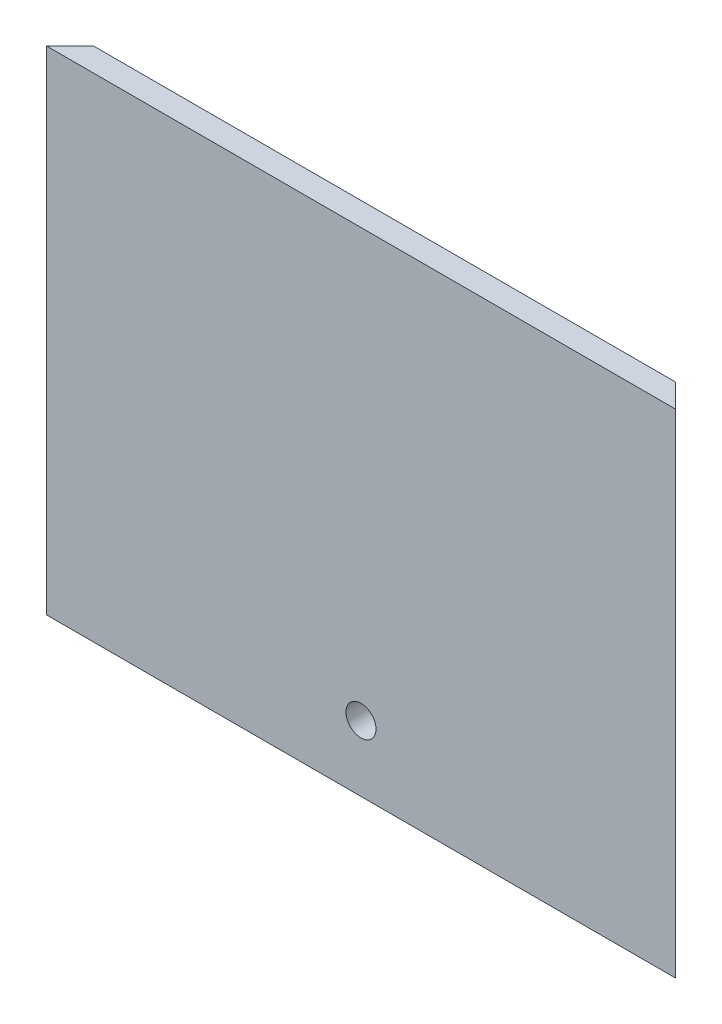
ISO-10303-21;
HEADER;
FILE_DESCRIPTION(('STEP AP214'),'2;1');
FILE_NAME('part.step','',(''),(''),'','','');
FILE_SCHEMA(('AUTOMOTIVE_DESIGN { 1 0 10303 214 1 1 1 1 }'));
ENDSEC;
DATA;
#1=APPLICATION_CONTEXT('core data for automotive mechanical design processes');
#2=APPLICATION_PROTOCOL_DEFINITION('international standard','automotive_design',2000,#1);
#3=PRODUCT_CONTEXT('',#1,'mechanical');
#4=PRODUCT('Part','Part','',(#3));
#5=PRODUCT_RELATED_PRODUCT_CATEGORY('part','',(#4));
#6=PRODUCT_DEFINITION_FORMATION('','',#4);
#7=PRODUCT_DEFINITION_CONTEXT('part definition',#1,'design');
#8=PRODUCT_DEFINITION('design','',#6,#7);
#9=PRODUCT_DEFINITION_SHAPE('','',#8);
#10=(LENGTH_UNIT() NAMED_UNIT(*) SI_UNIT(.MILLI.,.METRE.));
#11=(NAMED_UNIT(*) PLANE_ANGLE_UNIT() SI_UNIT($,.RADIAN.));
#12=(NAMED_UNIT(*) SI_UNIT($,.STERADIAN.) SOLID_ANGLE_UNIT());
#13=UNCERTAINTY_MEASURE_WITH_UNIT(LENGTH_MEASURE(1.E-05),#10,'distance_accuracy_value','');
#14=(GEOMETRIC_REPRESENTATION_CONTEXT(3) GLOBAL_UNCERTAINTY_ASSIGNED_CONTEXT((#13)) GLOBAL_UNIT_ASSIGNED_CONTEXT((#10,
#11,#12)) REPRESENTATION_CONTEXT('',''));
#15=CARTESIAN_POINT('',(0.,0.,0.));
#16=DIRECTION('',(0.,0.,1.));
#17=DIRECTION('',(1.,0.,0.));
#18=AXIS2_PLACEMENT_3D('',#15,#16,#17);
#19=CARTESIAN_POINT('',(0.,52.5,1.25));
#20=DIRECTION('',(0.,0.,1.));
#21=DIRECTION('',(1.,0.,0.));
#22=AXIS2_PLACEMENT_3D('',#19,#20,#21);
#23=PLANE('',#22);
#24=CARTESIAN_POINT('',(0.,7.,1.25));
#25=DIRECTION('',(0.,0.,1.));
#26=DIRECTION('',(1.,0.,0.));
#27=AXIS2_PLACEMENT_3D('',#24,#25,#26);
#28=CIRCLE('',#27,1.6);
#29=CARTESIAN_POINT('',(1.6,7.,1.25));
#30=VERTEX_POINT('',#29);
#31=EDGE_CURVE('E126',#30,#30,#28,.T.);
#32=ORIENTED_EDGE('',*,*,#31,.F.);
#33=EDGE_LOOP('',(#32));
#34=FACE_BOUND('',#33,.T.);
#35=DIRECTION('',(-1.,0.,0.));
#36=VECTOR('',#35,1.);
#37=CARTESIAN_POINT('',(0.,0.,1.25));
#38=LINE('',#37,#36);
#39=CARTESIAN_POINT('',(33.5,0.,1.25));
#40=VERTEX_POINT('',#39);
#41=CARTESIAN_POINT('',(-33.5,0.,1.25));
#42=VERTEX_POINT('',#41);
#43=EDGE_CURVE('E107',#40,#42,#38,.T.);
#44=ORIENTED_EDGE('',*,*,#43,.F.);
#45=DIRECTION('',(0.,-1.,0.));
#46=VECTOR('',#45,1.);
#47=CARTESIAN_POINT('',(33.5,52.5,1.25));
#48=LINE('',#47,#46);
#49=CARTESIAN_POINT('',(33.5,52.5,1.25));
#50=VERTEX_POINT('',#49);
#51=EDGE_CURVE('E11',#50,#40,#48,.T.);
#52=ORIENTED_EDGE('',*,*,#51,.F.);
#53=DIRECTION('',(-1.,0.,0.));
#54=VECTOR('',#53,1.);
#55=CARTESIAN_POINT('',(0.,52.5,1.25));
#56=LINE('',#55,#54);
#57=CARTESIAN_POINT('',(-33.5,52.5,1.25));
#58=VERTEX_POINT('',#57);
#59=EDGE_CURVE('E88',#50,#58,#56,.T.);
#60=ORIENTED_EDGE('',*,*,#59,.T.);
#61=DIRECTION('',(0.,-1.,0.));
#62=VECTOR('',#61,1.);
#63=CARTESIAN_POINT('',(-33.5,52.5,1.25));
#64=LINE('',#63,#62);
#65=EDGE_CURVE('E56',#58,#42,#64,.T.);
#66=ORIENTED_EDGE('',*,*,#65,.T.);
#67=EDGE_LOOP('',(#44,#52,#60,#66));
#68=FACE_BOUND('',#67,.T.);
#69=ADVANCED_FACE('F39',(#34,#68),#23,.T.);
#70=CARTESIAN_POINT('',(16.1249999999999,52.5,-16.125));
#71=DIRECTION('',(-0.707106781186546,0.,0.707106781186549));
#72=DIRECTION('',(0.707106781186549,0.,0.707106781186546));
#73=AXIS2_PLACEMENT_3D('',#70,#71,#72);
#74=PLANE('',#73);
#75=DIRECTION('',(-0.707106781186549,0.,-0.707106781186546));
#76=VECTOR('',#75,1.);
#77=CARTESIAN_POINT('',(16.1249999999999,0.,-16.125));
#78=LINE('',#77,#76);
#79=CARTESIAN_POINT('',(31.,0.,-1.25));
#80=VERTEX_POINT('',#79);
#81=EDGE_CURVE('E95',#40,#80,#78,.T.);
#82=ORIENTED_EDGE('',*,*,#81,.T.);
#83=DIRECTION('',(0.,-1.,0.));
#84=VECTOR('',#83,1.);
#85=CARTESIAN_POINT('',(31.,52.5,-1.25));
#86=LINE('',#85,#84);
#87=CARTESIAN_POINT('',(31.,52.5,-1.25));
#88=VERTEX_POINT('',#87);
#89=EDGE_CURVE('E48',#88,#80,#86,.T.);
#90=ORIENTED_EDGE('',*,*,#89,.F.);
#91=DIRECTION('',(-0.707106781186549,0.,-0.707106781186546));
#92=VECTOR('',#91,1.);
#93=CARTESIAN_POINT('',(16.1249999999999,52.5,-16.125));
#94=LINE('',#93,#92);
#95=EDGE_CURVE('E82',#50,#88,#94,.T.);
#96=ORIENTED_EDGE('',*,*,#95,.F.);
#97=ORIENTED_EDGE('',*,*,#51,.T.);
#98=EDGE_LOOP('',(#82,#90,#96,#97));
#99=FACE_BOUND('',#98,.T.);
#100=ADVANCED_FACE('F93',(#99),#74,.F.);
#101=CARTESIAN_POINT('',(0.,52.5,-1.25));
#102=DIRECTION('',(0.,0.,1.));
#103=DIRECTION('',(1.,0.,0.));
#104=AXIS2_PLACEMENT_3D('',#101,#102,#103);
#105=PLANE('',#104);
#106=CARTESIAN_POINT('',(0.,7.,-1.25));
#107=DIRECTION('',(0.,0.,1.));
#108=DIRECTION('',(1.,0.,0.));
#109=AXIS2_PLACEMENT_3D('',#106,#107,#108);
#110=CIRCLE('',#109,1.6);
#111=CARTESIAN_POINT('',(1.6,7.,-1.25));
#112=VERTEX_POINT('',#111);
#113=EDGE_CURVE('E110',#112,#112,#110,.T.);
#114=ORIENTED_EDGE('',*,*,#113,.T.);
#115=EDGE_LOOP('',(#114));
#116=FACE_BOUND('',#115,.T.);
#117=DIRECTION('',(-1.,0.,0.));
#118=VECTOR('',#117,1.);
#119=CARTESIAN_POINT('',(0.,0.,-1.25));
#120=LINE('',#119,#118);
#121=CARTESIAN_POINT('',(-31.,0.,-1.25));
#122=VERTEX_POINT('',#121);
#123=EDGE_CURVE('E113',#80,#122,#120,.T.);
#124=ORIENTED_EDGE('',*,*,#123,.T.);
#125=DIRECTION('',(0.,-1.,0.));
#126=VECTOR('',#125,1.);
#127=CARTESIAN_POINT('',(-31.,52.5,-1.25));
#128=LINE('',#127,#126);
#129=CARTESIAN_POINT('',(-31.,52.5,-1.25));
#130=VERTEX_POINT('',#129);
#131=EDGE_CURVE('E70',#130,#122,#128,.T.);
#132=ORIENTED_EDGE('',*,*,#131,.F.);
#133=DIRECTION('',(-1.,0.,0.));
#134=VECTOR('',#133,1.);
#135=CARTESIAN_POINT('',(0.,52.5,-1.25));
#136=LINE('',#135,#134);
#137=EDGE_CURVE('E87',#88,#130,#136,.T.);
#138=ORIENTED_EDGE('',*,*,#137,.F.);
#139=ORIENTED_EDGE('',*,*,#89,.T.);
#140=EDGE_LOOP('',(#124,#132,#138,#139));
#141=FACE_BOUND('',#140,.T.);
#142=ADVANCED_FACE('F99',(#116,#141),#105,.F.);
#143=CARTESIAN_POINT('',(-16.1250000000001,52.5,-16.125));
#144=DIRECTION('',(-0.707106781186549,0.,-0.707106781186546));
#145=DIRECTION('',(-0.707106781186546,0.,0.707106781186549));
#146=AXIS2_PLACEMENT_3D('',#143,#144,#145);
#147=PLANE('',#146);
#148=DIRECTION('',(0.707106781186546,0.,-0.707106781186549));
#149=VECTOR('',#148,1.);
#150=CARTESIAN_POINT('',(-16.1250000000001,0.,-16.125));
#151=LINE('',#150,#149);
#152=EDGE_CURVE('E116',#42,#122,#151,.T.);
#153=ORIENTED_EDGE('',*,*,#152,.F.);
#154=ORIENTED_EDGE('',*,*,#65,.F.);
#155=DIRECTION('',(0.707106781186546,0.,-0.707106781186549));
#156=VECTOR('',#155,1.);
#157=CARTESIAN_POINT('',(-16.1250000000001,52.5,-16.125));
#158=LINE('',#157,#156);
#159=EDGE_CURVE('E101',#58,#130,#158,.T.);
#160=ORIENTED_EDGE('',*,*,#159,.T.);
#161=ORIENTED_EDGE('',*,*,#131,.T.);
#162=EDGE_LOOP('',(#153,#154,#160,#161));
#163=FACE_BOUND('',#162,.T.);
#164=ADVANCED_FACE('F143',(#163),#147,.T.);
#165=CARTESIAN_POINT('',(0.,52.5,0.));
#166=DIRECTION('',(0.,1.,0.));
#167=DIRECTION('',(0.,0.,1.));
#168=AXIS2_PLACEMENT_3D('',#165,#166,#167);
#169=PLANE('',#168);
#170=ORIENTED_EDGE('',*,*,#59,.F.);
#171=ORIENTED_EDGE('',*,*,#95,.T.);
#172=ORIENTED_EDGE('',*,*,#137,.T.);
#173=ORIENTED_EDGE('',*,*,#159,.F.);
#174=EDGE_LOOP('',(#170,#171,#172,#173));
#175=FACE_BOUND('',#174,.T.);
#176=ADVANCED_FACE('F84',(#175),#169,.T.);
#177=CARTESIAN_POINT('',(0.,0.,0.));
#178=DIRECTION('',(0.,1.,0.));
#179=DIRECTION('',(0.,0.,1.));
#180=AXIS2_PLACEMENT_3D('',#177,#178,#179);
#181=PLANE('',#180);
#182=ORIENTED_EDGE('',*,*,#43,.T.);
#183=ORIENTED_EDGE('',*,*,#152,.T.);
#184=ORIENTED_EDGE('',*,*,#123,.F.);
#185=ORIENTED_EDGE('',*,*,#81,.F.);
#186=EDGE_LOOP('',(#182,#183,#184,#185));
#187=FACE_BOUND('',#186,.T.);
#188=ADVANCED_FACE('F138',(#187),#181,.F.);
#189=CARTESIAN_POINT('',(0.,7.,-1.25));
#190=DIRECTION('',(0.,0.,1.));
#191=DIRECTION('',(1.,0.,0.));
#192=AXIS2_PLACEMENT_3D('',#189,#190,#191);
#193=CYLINDRICAL_SURFACE('',#192,1.6);
#194=ORIENTED_EDGE('',*,*,#113,.F.);
#195=EDGE_LOOP('',(#194));
#196=FACE_BOUND('',#195,.T.);
#197=ORIENTED_EDGE('',*,*,#31,.T.);
#198=EDGE_LOOP('',(#197));
#199=FACE_BOUND('',#198,.T.);
#200=ADVANCED_FACE('F135',(#196,#199),#193,.F.);
#201=CLOSED_SHELL('',(#69,#100,#142,#164,#176,#188,#200));
#202=MANIFOLD_SOLID_BREP('B2',#201);
#203=ADVANCED_BREP_SHAPE_REPRESENTATION('',(#18,#202),#14);
#204=SHAPE_DEFINITION_REPRESENTATION(#9,#203);
ENDSEC;
END-ISO-10303-21;
